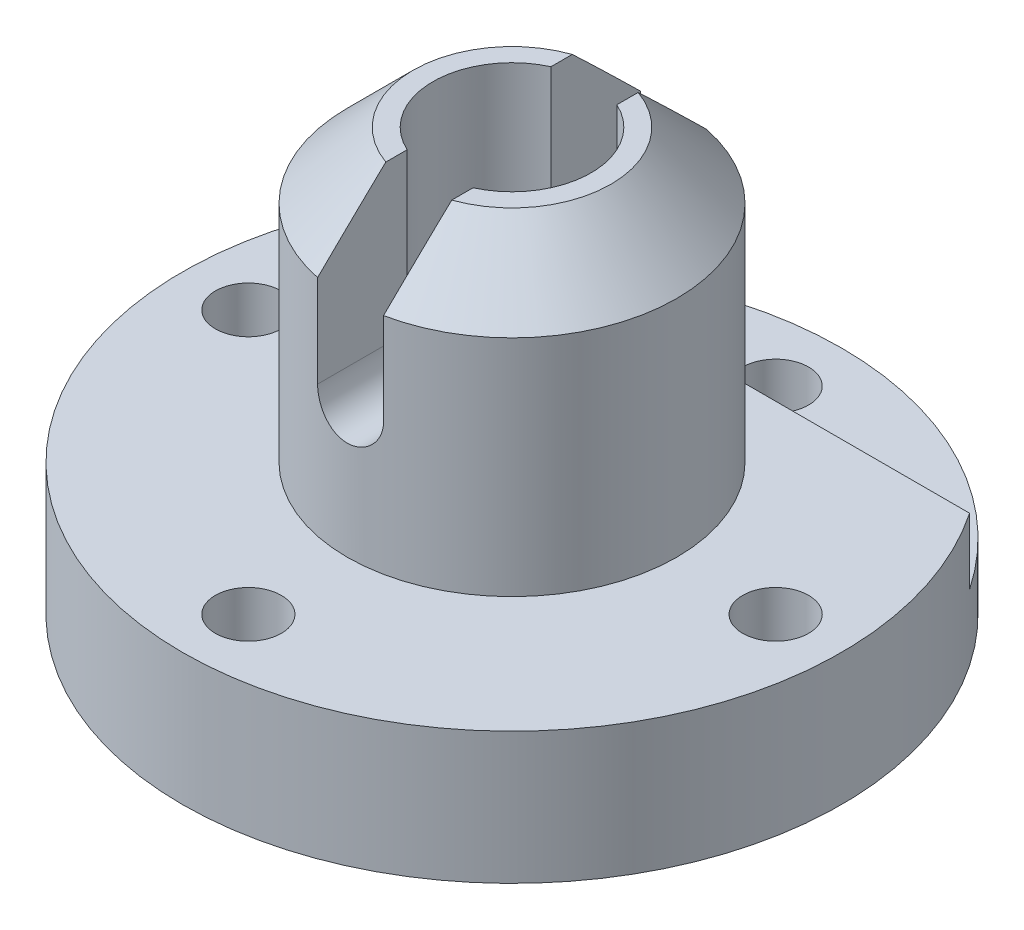
ISO-10303-21;
HEADER;
FILE_DESCRIPTION(('STEP AP214'),'2;1');
FILE_NAME('part.step','',(''),(''),'','','');
FILE_SCHEMA(('AUTOMOTIVE_DESIGN { 1 0 10303 214 1 1 1 1 }'));
ENDSEC;
DATA;
#1=APPLICATION_CONTEXT('core data for automotive mechanical design processes');
#2=APPLICATION_PROTOCOL_DEFINITION('international standard','automotive_design',2000,#1);
#3=PRODUCT_CONTEXT('',#1,'mechanical');
#4=PRODUCT('Part','Part','',(#3));
#5=PRODUCT_RELATED_PRODUCT_CATEGORY('part','',(#4));
#6=PRODUCT_DEFINITION_FORMATION('','',#4);
#7=PRODUCT_DEFINITION_CONTEXT('part definition',#1,'design');
#8=PRODUCT_DEFINITION('design','',#6,#7);
#9=PRODUCT_DEFINITION_SHAPE('','',#8);
#10=(LENGTH_UNIT() NAMED_UNIT(*) SI_UNIT(.MILLI.,.METRE.));
#11=(NAMED_UNIT(*) PLANE_ANGLE_UNIT() SI_UNIT($,.RADIAN.));
#12=(NAMED_UNIT(*) SI_UNIT($,.STERADIAN.) SOLID_ANGLE_UNIT());
#13=UNCERTAINTY_MEASURE_WITH_UNIT(LENGTH_MEASURE(1.E-05),#10,'distance_accuracy_value','');
#14=(GEOMETRIC_REPRESENTATION_CONTEXT(3) GLOBAL_UNCERTAINTY_ASSIGNED_CONTEXT((#13)) GLOBAL_UNIT_ASSIGNED_CONTEXT((#10,
#11,#12)) REPRESENTATION_CONTEXT('',''));
#15=CARTESIAN_POINT('',(0.,0.,0.));
#16=DIRECTION('',(0.,0.,1.));
#17=DIRECTION('',(1.,0.,0.));
#18=AXIS2_PLACEMENT_3D('',#15,#16,#17);
#19=CARTESIAN_POINT('',(0.,32.,0.));
#20=DIRECTION('',(0.,-1.,0.));
#21=DIRECTION('',(0.,0.,-1.));
#22=AXIS2_PLACEMENT_3D('',#19,#20,#21);
#23=CYLINDRICAL_SURFACE('',#22,6.);
#24=CARTESIAN_POINT('',(0.,10.,0.));
#25=DIRECTION('',(0.,1.,0.));
#26=DIRECTION('',(0.,0.,1.));
#27=AXIS2_PLACEMENT_3D('',#24,#25,#26);
#28=CIRCLE('',#27,6.);
#29=CARTESIAN_POINT('',(0.,10.,6.));
#30=VERTEX_POINT('',#29);
#31=EDGE_CURVE('E164',#30,#30,#28,.F.);
#32=ORIENTED_EDGE('',*,*,#31,.T.);
#33=EDGE_LOOP('',(#32));
#34=FACE_BOUND('',#33,.T.);
#35=CARTESIAN_POINT('',(0.,32.,0.));
#36=DIRECTION('',(0.,1.,0.));
#37=DIRECTION('',(0.,0.,1.));
#38=AXIS2_PLACEMENT_3D('',#35,#36,#37);
#39=CIRCLE('',#38,6.);
#40=CARTESIAN_POINT('',(-2.5,32.,-5.45435605731786));
#41=VERTEX_POINT('',#40);
#42=CARTESIAN_POINT('',(-2.5,32.,5.45435605731786));
#43=VERTEX_POINT('',#42);
#44=EDGE_CURVE('E154',#41,#43,#39,.T.);
#45=ORIENTED_EDGE('',*,*,#44,.T.);
#46=DIRECTION('',(0.,-1.,0.));
#47=VECTOR('',#46,1.);
#48=CARTESIAN_POINT('',(-2.5,32.,5.45435605731786));
#49=LINE('',#48,#47);
#50=CARTESIAN_POINT('',(-2.5,20.,5.45435605731786));
#51=VERTEX_POINT('',#50);
#52=EDGE_CURVE('E213',#43,#51,#49,.T.);
#53=ORIENTED_EDGE('',*,*,#52,.T.);
#54=CARTESIAN_POINT('',(2.5,20.,5.45435605731786));
#55=CARTESIAN_POINT('',(2.50001024965806,19.933009578603,5.4543414367274));
#56=CARTESIAN_POINT('',(2.49730766074456,19.8660271423929,5.45558986423115));
#57=CARTESIAN_POINT('',(2.48655699342007,19.732608782394,5.46050344433192));
#58=CARTESIAN_POINT('',(2.47851112553775,19.6661726441022,5.46416759753227));
#59=CARTESIAN_POINT('',(2.45719882557102,19.5345981401286,5.47378318611766));
#60=CARTESIAN_POINT('',(2.44395446621823,19.4694554951153,5.47972494833872));
#61=CARTESIAN_POINT('',(2.41239773056354,19.3406523494294,5.49369035165668));
#62=CARTESIAN_POINT('',(2.39408500729503,19.2769919505508,5.50171413528084));
#63=CARTESIAN_POINT('',(2.33184505253746,19.0890295233108,5.52852216859036));
#64=CARTESIAN_POINT('',(2.28056973965756,18.9674650590801,5.55006534458072));
#65=CARTESIAN_POINT('',(2.16009667726577,18.734605030022,5.5980502687434));
#66=CARTESIAN_POINT('',(2.09088024017803,18.6233203375838,5.62449711638194));
#67=CARTESIAN_POINT('',(1.93194216605246,18.4073444819703,5.68111739532849));
#68=CARTESIAN_POINT('',(1.84129131772597,18.3033685362414,5.71141645652258));
#69=CARTESIAN_POINT('',(1.64402473251641,18.1115830630309,5.77129106659512));
#70=CARTESIAN_POINT('',(1.53740558511416,18.0237769980765,5.80086645933832));
#71=CARTESIAN_POINT('',(1.30552662419109,17.8631011710238,5.85751079611205));
#72=CARTESIAN_POINT('',(1.17965801419142,17.7910465122975,5.88441492036276));
#73=CARTESIAN_POINT('',(0.916263349803656,17.6694476051954,5.93113050419022));
#74=CARTESIAN_POINT('',(0.778742558960749,17.6198932565872,5.95094514533806));
#75=CARTESIAN_POINT('',(0.503538212911764,17.5473214289529,5.98035028996095));
#76=CARTESIAN_POINT('',(0.366235636683351,17.5230570539867,5.99041924152298));
#77=CARTESIAN_POINT('',(0.0891608856613077,17.497724732109,6.00093656296527));
#78=CARTESIAN_POINT('',(-0.0506103107853693,17.4966477933812,6.00138866214753));
#79=CARTESIAN_POINT('',(-0.319586702683724,17.5170686483622,5.99290254661358));
#80=CARTESIAN_POINT('',(-0.448917245472143,17.5371965487351,5.98453414521297));
#81=CARTESIAN_POINT('',(-0.70216796354397,17.5971069089122,5.96013005449445));
#82=CARTESIAN_POINT('',(-0.826087834150438,17.6368904739846,5.94409393401056));
#83=CARTESIAN_POINT('',(-1.06727556823007,17.7354557836619,5.90559715444489));
#84=CARTESIAN_POINT('',(-1.1844130633202,17.7945181793044,5.88304219015531));
#85=CARTESIAN_POINT('',(-1.40742238732223,17.9296907819691,5.83371457161593));
#86=CARTESIAN_POINT('',(-1.51329009151026,18.0058071993045,5.80694038196897));
#87=CARTESIAN_POINT('',(-1.71867537807254,18.1791590335425,5.74963576527152));
#88=CARTESIAN_POINT('',(-1.81722082953265,18.2775041712583,5.71897359653013));
#89=CARTESIAN_POINT('',(-1.99685313522822,18.4894106464249,5.65876079183101));
#90=CARTESIAN_POINT('',(-2.07793113494236,18.6029796539946,5.62921072584973));
#91=CARTESIAN_POINT('',(-2.22284514508404,18.8468546501545,5.57361619012468));
#92=CARTESIAN_POINT('',(-2.2860150420634,18.9775928734739,5.54772171984214));
#93=CARTESIAN_POINT('',(-2.38897619183128,19.2491453734569,5.5041766144793));
#94=CARTESIAN_POINT('',(-2.4288105117282,19.3899405469978,5.48651080537515));
#95=CARTESIAN_POINT('',(-2.47065526537902,19.6101508434078,5.46773287951056));
#96=CARTESIAN_POINT('',(-2.48164099212926,19.6876310667866,5.46274303006064));
#97=CARTESIAN_POINT('',(-2.49631631258703,19.8433901813395,5.45604541462647));
#98=CARTESIAN_POINT('',(-2.50000851178051,19.9216687772607,5.45433647659977));
#99=CARTESIAN_POINT('',(-2.5,20.,5.45435605731786));
#100=B_SPLINE_CURVE_WITH_KNOTS('',3,(#54,#55,#56,#57,#58,#59,#60,#61,#62,#63,#64,#65,#66,#67,
#68,#69,#70,#71,#72,#73,#74,#75,#76,#77,#78,#79,#80,#81,#82,#83,#84,#85,#86,#87,#88,#89,#90,#91,
#92,#93,#94,#95,#96,#97,#98,#99),.UNSPECIFIED.,.F.,.F.,(4,2,2,2,2,2,2,2,2,2,2,2,2,2,2,2,2,2,2,2,
2,2,4),(0.,0.200891876435012,0.401700695097973,0.601665948391959,0.801644894158599,
1.20075599352942,1.6002844916061,2.02212344548655,2.44405262481498,2.88432120276328,
3.32439195134774,3.74155898035476,4.15856423395471,4.55019084443641,4.94183947919071,
5.33946474085078,5.73723503589979,6.16301556467703,6.58901142297275,7.02923147484727,
7.4686364954648,7.70350874445825,7.93829707423866),.UNSPECIFIED.);
#101=CARTESIAN_POINT('',(2.5,20.,5.45435605731786));
#102=VERTEX_POINT('',#101);
#103=EDGE_CURVE('E146',#102,#51,#100,.T.);
#104=ORIENTED_EDGE('',*,*,#103,.F.);
#105=DIRECTION('',(0.,-1.,0.));
#106=VECTOR('',#105,1.);
#107=CARTESIAN_POINT('',(2.5,32.,5.45435605731786));
#108=LINE('',#107,#106);
#109=CARTESIAN_POINT('',(2.5,32.,5.45435605731786));
#110=VERTEX_POINT('',#109);
#111=EDGE_CURVE('E132',#110,#102,#108,.T.);
#112=ORIENTED_EDGE('',*,*,#111,.F.);
#113=CARTESIAN_POINT('',(2.5,32.,-5.45435605731786));
#114=VERTEX_POINT('',#113);
#115=EDGE_CURVE('E144',#110,#114,#39,.T.);
#116=ORIENTED_EDGE('',*,*,#115,.T.);
#117=DIRECTION('',(0.,-1.,0.));
#118=VECTOR('',#117,1.);
#119=CARTESIAN_POINT('',(2.5,32.,-5.45435605731786));
#120=LINE('',#119,#118);
#121=CARTESIAN_POINT('',(2.5,20.,-5.45435605731786));
#122=VERTEX_POINT('',#121);
#123=EDGE_CURVE('E148',#122,#114,#120,.F.);
#124=ORIENTED_EDGE('',*,*,#123,.F.);
#125=CARTESIAN_POINT('',(-2.5,20.,-5.45435605731786));
#126=CARTESIAN_POINT('',(-2.50001024965806,19.933009578603,-5.4543414367274));
#127=CARTESIAN_POINT('',(-2.49730766074456,19.8660271423929,-5.45558986423115));
#128=CARTESIAN_POINT('',(-2.48655699342007,19.732608782394,-5.46050344433192));
#129=CARTESIAN_POINT('',(-2.47851112553775,19.6661726441022,-5.46416759753227));
#130=CARTESIAN_POINT('',(-2.45719882557102,19.5345981401286,-5.47378318611766));
#131=CARTESIAN_POINT('',(-2.44395446621823,19.4694554951153,-5.47972494833872));
#132=CARTESIAN_POINT('',(-2.41239773056354,19.3406523494294,-5.49369035165668));
#133=CARTESIAN_POINT('',(-2.39408500729503,19.2769919505508,-5.50171413528084));
#134=CARTESIAN_POINT('',(-2.33184505253746,19.0890295233108,-5.52852216859036));
#135=CARTESIAN_POINT('',(-2.28056973965756,18.9674650590801,-5.55006534458073));
#136=CARTESIAN_POINT('',(-2.16009667726576,18.734605030022,-5.5980502687434));
#137=CARTESIAN_POINT('',(-2.09088024017802,18.6233203375838,-5.62449711638194));
#138=CARTESIAN_POINT('',(-1.93194216605246,18.4073444819703,-5.6811173953285));
#139=CARTESIAN_POINT('',(-1.84129131772596,18.3033685362415,-5.71141645652258));
#140=CARTESIAN_POINT('',(-1.6440247325164,18.1115830630309,-5.77129106659512));
#141=CARTESIAN_POINT('',(-1.53740558511415,18.0237769980765,-5.80086645933832));
#142=CARTESIAN_POINT('',(-1.30552662419109,17.8631011710238,-5.85751079611205));
#143=CARTESIAN_POINT('',(-1.17965801419141,17.7910465122975,-5.88441492036276));
#144=CARTESIAN_POINT('',(-0.916263349803652,17.6694476051954,-5.93113050419023));
#145=CARTESIAN_POINT('',(-0.778742558960745,17.6198932565872,-5.95094514533806));
#146=CARTESIAN_POINT('',(-0.50353821291176,17.5473214289529,-5.98035028996095));
#147=CARTESIAN_POINT('',(-0.366235636683347,17.5230570539867,-5.99041924152298));
#148=CARTESIAN_POINT('',(-0.0891608856613034,17.497724732109,-6.00093656296527));
#149=CARTESIAN_POINT('',(0.0506103107853736,17.4966477933812,-6.00138866214753));
#150=CARTESIAN_POINT('',(0.319586702683728,17.5170686483622,-5.99290254661358));
#151=CARTESIAN_POINT('',(0.448917245472147,17.5371965487351,-5.98453414521297));
#152=CARTESIAN_POINT('',(0.702167963543975,17.5971069089122,-5.96013005449445));
#153=CARTESIAN_POINT('',(0.826087834150443,17.6368904739846,-5.94409393401056));
#154=CARTESIAN_POINT('',(1.06727556823007,17.7354557836619,-5.90559715444489));
#155=CARTESIAN_POINT('',(1.18441306332021,17.7945181793044,-5.88304219015531));
#156=CARTESIAN_POINT('',(1.40742238732224,17.9296907819691,-5.83371457161593));
#157=CARTESIAN_POINT('',(1.51329009151026,18.0058071993045,-5.80694038196897));
#158=CARTESIAN_POINT('',(1.71867537807254,18.1791590335425,-5.74963576527152));
#159=CARTESIAN_POINT('',(1.81722082953265,18.2775041712583,-5.71897359653013));
#160=CARTESIAN_POINT('',(1.99685313522822,18.4894106464249,-5.65876079183101));
#161=CARTESIAN_POINT('',(2.07793113494236,18.6029796539946,-5.62921072584973));
#162=CARTESIAN_POINT('',(2.22284514508405,18.8468546501545,-5.57361619012468));
#163=CARTESIAN_POINT('',(2.28601504206341,18.9775928734739,-5.54772171984214));
#164=CARTESIAN_POINT('',(2.38897619183128,19.2491453734569,-5.50417661447929));
#165=CARTESIAN_POINT('',(2.4288105117282,19.3899405469978,-5.48651080537515));
#166=CARTESIAN_POINT('',(2.47065526537903,19.6101508434078,-5.46773287951056));
#167=CARTESIAN_POINT('',(2.48164099212927,19.6876310667866,-5.46274303006064));
#168=CARTESIAN_POINT('',(2.49631631258704,19.8433901813395,-5.45604541462647));
#169=CARTESIAN_POINT('',(2.50000851178052,19.9216687772607,-5.45433647659977));
#170=CARTESIAN_POINT('',(2.5,20.,-5.45435605731786));
#171=B_SPLINE_CURVE_WITH_KNOTS('',3,(#125,#126,#127,#128,#129,#130,#131,#132,#133,#134,#135,
#136,#137,#138,#139,#140,#141,#142,#143,#144,#145,#146,#147,#148,#149,#150,#151,#152,#153,#154,
#155,#156,#157,#158,#159,#160,#161,#162,#163,#164,#165,#166,#167,#168,#169,#170),.UNSPECIFIED.,
.F.,.F.,(4,2,2,2,2,2,2,2,2,2,2,2,2,2,2,2,2,2,2,2,2,2,4),(0.,0.200891876435012,0.401700695097973,
0.601665948391959,0.801644894158599,1.20075599352942,1.6002844916061,2.02212344548655,
2.44405262481498,2.88432120276328,3.32439195134774,3.74155898035476,4.15856423395471,
4.55019084443641,4.94183947919071,5.33946474085078,5.73723503589979,6.16301556467703,
6.58901142297275,7.02923147484728,7.4686364954648,7.70350874445825,7.93829707423866),.UNSPECIFIED.);
#172=CARTESIAN_POINT('',(-2.5,20.,-5.45435605731786));
#173=VERTEX_POINT('',#172);
#174=EDGE_CURVE('E208',#173,#122,#171,.T.);
#175=ORIENTED_EDGE('',*,*,#174,.F.);
#176=DIRECTION('',(0.,-1.,0.));
#177=VECTOR('',#176,1.);
#178=CARTESIAN_POINT('',(-2.5,32.,-5.45435605731786));
#179=LINE('',#178,#177);
#180=EDGE_CURVE('E323',#173,#41,#179,.F.);
#181=ORIENTED_EDGE('',*,*,#180,.T.);
#182=EDGE_LOOP('',(#45,#53,#104,#112,#116,#124,#175,#181));
#183=FACE_BOUND('',#182,.T.);
#184=ADVANCED_FACE('F38',(#34,#183),#23,.F.);
#185=CARTESIAN_POINT('',(0.,32.,0.));
#186=DIRECTION('',(0.,-1.,0.));
#187=DIRECTION('',(0.,0.,-1.));
#188=AXIS2_PLACEMENT_3D('',#185,#186,#187);
#189=CYLINDRICAL_SURFACE('',#188,12.5);
#190=CARTESIAN_POINT('',(0.,10.,0.));
#191=DIRECTION('',(0.,1.,0.));
#192=DIRECTION('',(0.,0.,1.));
#193=AXIS2_PLACEMENT_3D('',#190,#191,#192);
#194=CIRCLE('',#193,12.5);
#195=CARTESIAN_POINT('',(0.,10.,12.5));
#196=VERTEX_POINT('',#195);
#197=EDGE_CURVE('E153',#196,#196,#194,.F.);
#198=ORIENTED_EDGE('',*,*,#197,.F.);
#199=EDGE_LOOP('',(#198));
#200=FACE_BOUND('',#199,.T.);
#201=DIRECTION('',(0.,-1.,0.));
#202=VECTOR('',#201,1.);
#203=CARTESIAN_POINT('',(-2.5,32.,12.2474487139159));
#204=LINE('',#203,#202);
#205=CARTESIAN_POINT('',(-2.5,27.,12.2474487139159));
#206=VERTEX_POINT('',#205);
#207=CARTESIAN_POINT('',(-2.5,20.,12.2474487139159));
#208=VERTEX_POINT('',#207);
#209=EDGE_CURVE('E322',#206,#208,#204,.T.);
#210=ORIENTED_EDGE('',*,*,#209,.F.);
#211=CARTESIAN_POINT('',(0.,27.,0.));
#212=DIRECTION('',(0.,1.,0.));
#213=DIRECTION('',(0.,0.,1.));
#214=AXIS2_PLACEMENT_3D('',#211,#212,#213);
#215=CIRCLE('',#214,12.5);
#216=CARTESIAN_POINT('',(-2.5,27.,-12.2474487139159));
#217=VERTEX_POINT('',#216);
#218=EDGE_CURVE('E258',#206,#217,#215,.F.);
#219=ORIENTED_EDGE('',*,*,#218,.T.);
#220=DIRECTION('',(0.,-1.,0.));
#221=VECTOR('',#220,1.);
#222=CARTESIAN_POINT('',(-2.5,32.,-12.2474487139159));
#223=LINE('',#222,#221);
#224=CARTESIAN_POINT('',(-2.5,20.,-12.2474487139159));
#225=VERTEX_POINT('',#224);
#226=EDGE_CURVE('E147',#225,#217,#223,.F.);
#227=ORIENTED_EDGE('',*,*,#226,.F.);
#228=CARTESIAN_POINT('',(-2.5,20.,-12.2474487139159));
#229=CARTESIAN_POINT('',(-2.50000755272741,19.9304359928512,-12.2474426870481));
#230=CARTESIAN_POINT('',(-2.49709659553059,19.8608761581153,-12.2480412546813));
#231=CARTESIAN_POINT('',(-2.48549624534853,19.7222682500258,-12.2504029528616));
#232=CARTESIAN_POINT('',(-2.47680756718742,19.6532201144329,-12.2521659393457));
#233=CARTESIAN_POINT('',(-2.45372788482214,19.5162257533478,-12.25680833904));
#234=CARTESIAN_POINT('',(-2.43934556755122,19.4482780125864,-12.259686051341));
#235=CARTESIAN_POINT('',(-2.40500601307056,19.3138779894138,-12.2664685140533));
#236=CARTESIAN_POINT('',(-2.38504875310239,19.2474257131086,-12.2703732686573));
#237=CARTESIAN_POINT('',(-2.31701273293409,19.0509952453208,-12.2834692504436));
#238=CARTESIAN_POINT('',(-2.26075131705718,18.9238349517029,-12.2940461363477));
#239=CARTESIAN_POINT('',(-2.12812970933265,18.6808105143781,-12.3176934066007));
#240=CARTESIAN_POINT('',(-2.0517674343692,18.5649475431551,-12.3307640493469));
#241=CARTESIAN_POINT('',(-1.87995278838546,18.3461078517031,-12.3581317705241));
#242=CARTESIAN_POINT('',(-1.78427266064757,18.2433112895975,-12.3724421926957));
#243=CARTESIAN_POINT('',(-1.57702607132326,18.0551119063013,-12.4005606698654));
#244=CARTESIAN_POINT('',(-1.46545715284151,17.9697117801072,-12.4143686467546));
#245=CARTESIAN_POINT('',(-1.2284002437141,17.8180282891781,-12.4400702526805));
#246=CARTESIAN_POINT('',(-1.10279959145392,17.751917721986,-12.4519461799055));
#247=CARTESIAN_POINT('',(-0.842002975760172,17.6418101436303,-12.4722938885068));
#248=CARTESIAN_POINT('',(-0.706808435013477,17.5978098614993,-12.4807661733763));
#249=CARTESIAN_POINT('',(-0.432543529973129,17.5337324169305,-12.4932579438613));
#250=CARTESIAN_POINT('',(-0.293547588516976,17.5133480364947,-12.4973345628875));
#251=CARTESIAN_POINT('',(-0.0140496897959922,17.4961225412003,-12.5007730438039));
#252=CARTESIAN_POINT('',(0.126452156532597,17.499279703838,-12.5001352506414));
#253=CARTESIAN_POINT('',(0.402855506346822,17.5288155036062,-12.494260861056));
#254=CARTESIAN_POINT('',(0.538794033247035,17.5548626254794,-12.4890899207821));
#255=CARTESIAN_POINT('',(0.804330016531258,17.6289129417226,-12.4748043625546));
#256=CARTESIAN_POINT('',(0.933927265392435,17.6769168541128,-12.4656896156329));
#257=CARTESIAN_POINT('',(1.1840506782429,17.7938260089324,-12.4444322280103));
#258=CARTESIAN_POINT('',(1.30451431703059,17.8628614673669,-12.4322708097766));
#259=CARTESIAN_POINT('',(1.53226609471824,18.0197756756397,-12.4062612907301));
#260=CARTESIAN_POINT('',(1.63955314055332,18.1076559870953,-12.3924130501763));
#261=CARTESIAN_POINT('',(1.83986551634353,18.3015709040774,-12.3642759342124));
#262=CARTESIAN_POINT('',(1.93261173748933,18.4078935051827,-12.3499835810434));
#263=CARTESIAN_POINT('',(2.0990272497494,18.6347618962184,-12.3227926529107));
#264=CARTESIAN_POINT('',(2.17269125605404,18.7553116129146,-12.3098944646352));
#265=CARTESIAN_POINT('',(2.29894988661171,19.0076310123658,-12.286943251058));
#266=CARTESIAN_POINT('',(2.3514871915862,19.1394300584917,-12.2768979874586));
#267=CARTESIAN_POINT('',(2.43351774332483,19.4101465781389,-12.2609040265623));
#268=CARTESIAN_POINT('',(2.46304531871083,19.5490531166203,-12.2549492282072));
#269=CARTESIAN_POINT('',(2.48708234530492,19.7408920421161,-12.2500794297991));
#270=CARTESIAN_POINT('',(2.49192813913878,19.7926353494561,-12.2490939967998));
#271=CARTESIAN_POINT('',(2.49838291166163,19.8962446603435,-12.2477791846693));
#272=CARTESIAN_POINT('',(2.49999730726164,19.9481103123894,-12.2474487076206));
#273=CARTESIAN_POINT('',(2.5,20.,-12.2474487139159));
#274=B_SPLINE_CURVE_WITH_KNOTS('',3,(#228,#229,#230,#231,#232,#233,#234,#235,#236,#237,#238,
#239,#240,#241,#242,#243,#244,#245,#246,#247,#248,#249,#250,#251,#252,#253,#254,#255,#256,#257,
#258,#259,#260,#261,#262,#263,#264,#265,#266,#267,#268,#269,#270,#271,#272,#273),.UNSPECIFIED.,
.F.,.F.,(4,2,2,2,2,2,2,2,2,2,2,2,2,2,2,2,2,2,2,2,2,2,4),(0.,0.208621275894803,0.417216745803839,
0.62549517523698,0.833774454931106,1.25000691135225,1.66628252025787,2.08778731527755,
2.50935735880446,2.93459542557449,3.35977056463055,3.77935021287091,4.19889916132035,
4.61247011057754,5.02605458519858,5.44225366753897,5.85848725240716,6.28192795775072,
6.70548580970531,7.13018519486866,7.55424974394838,7.71010621722895,7.86570120305829),.UNSPECIFIED.);
#275=CARTESIAN_POINT('',(2.5,20.,-12.2474487139159));
#276=VERTEX_POINT('',#275);
#277=EDGE_CURVE('E175',#225,#276,#274,.T.);
#278=ORIENTED_EDGE('',*,*,#277,.T.);
#279=DIRECTION('',(0.,-1.,0.));
#280=VECTOR('',#279,1.);
#281=CARTESIAN_POINT('',(2.5,32.,-12.2474487139159));
#282=LINE('',#281,#280);
#283=CARTESIAN_POINT('',(2.5,27.,-12.2474487139159));
#284=VERTEX_POINT('',#283);
#285=EDGE_CURVE('E314',#276,#284,#282,.F.);
#286=ORIENTED_EDGE('',*,*,#285,.T.);
#287=CARTESIAN_POINT('',(0.,27.,0.));
#288=DIRECTION('',(0.,1.,0.));
#289=DIRECTION('',(0.,0.,1.));
#290=AXIS2_PLACEMENT_3D('',#287,#288,#289);
#291=CIRCLE('',#290,12.5);
#292=CARTESIAN_POINT('',(2.5,27.,12.2474487139159));
#293=VERTEX_POINT('',#292);
#294=EDGE_CURVE('E339',#284,#293,#291,.F.);
#295=ORIENTED_EDGE('',*,*,#294,.T.);
#296=DIRECTION('',(0.,-1.,0.));
#297=VECTOR('',#296,1.);
#298=CARTESIAN_POINT('',(2.5,32.,12.2474487139159));
#299=LINE('',#298,#297);
#300=CARTESIAN_POINT('',(2.5,20.,12.2474487139159));
#301=VERTEX_POINT('',#300);
#302=EDGE_CURVE('E317',#293,#301,#299,.T.);
#303=ORIENTED_EDGE('',*,*,#302,.T.);
#304=CARTESIAN_POINT('',(2.5,20.,12.2474487139159));
#305=CARTESIAN_POINT('',(2.50000755272741,19.9304359928512,12.2474426870481));
#306=CARTESIAN_POINT('',(2.4970965955306,19.8608761581153,12.2480412546813));
#307=CARTESIAN_POINT('',(2.48549624534853,19.7222682500258,12.2504029528616));
#308=CARTESIAN_POINT('',(2.47680756718743,19.6532201144329,12.2521659393457));
#309=CARTESIAN_POINT('',(2.45372788482215,19.5162257533478,12.25680833904));
#310=CARTESIAN_POINT('',(2.43934556755123,19.4482780125864,12.259686051341));
#311=CARTESIAN_POINT('',(2.40500601307056,19.3138779894138,12.2664685140532));
#312=CARTESIAN_POINT('',(2.38504875310239,19.2474257131086,12.2703732686573));
#313=CARTESIAN_POINT('',(2.31701273293409,19.0509952453208,12.2834692504436));
#314=CARTESIAN_POINT('',(2.26075131705718,18.9238349517029,12.2940461363477));
#315=CARTESIAN_POINT('',(2.12812970933265,18.6808105143781,12.3176934066007));
#316=CARTESIAN_POINT('',(2.0517674343692,18.5649475431551,12.3307640493469));
#317=CARTESIAN_POINT('',(1.87995278838546,18.3461078517031,12.3581317705241));
#318=CARTESIAN_POINT('',(1.78427266064758,18.2433112895975,12.3724421926957));
#319=CARTESIAN_POINT('',(1.57702607132326,18.0551119063013,12.4005606698654));
#320=CARTESIAN_POINT('',(1.46545715284151,17.9697117801072,12.4143686467546));
#321=CARTESIAN_POINT('',(1.2284002437141,17.8180282891781,12.4400702526805));
#322=CARTESIAN_POINT('',(1.10279959145392,17.751917721986,12.4519461799055));
#323=CARTESIAN_POINT('',(0.842002975760175,17.6418101436303,12.4722938885068));
#324=CARTESIAN_POINT('',(0.70680843501348,17.5978098614993,12.4807661733763));
#325=CARTESIAN_POINT('',(0.432543529973132,17.5337324169305,12.4932579438613));
#326=CARTESIAN_POINT('',(0.293547588516979,17.5133480364947,12.4973345628875));
#327=CARTESIAN_POINT('',(0.0140496897959956,17.4961225412003,12.5007730438039));
#328=CARTESIAN_POINT('',(-0.126452156532594,17.499279703838,12.5001352506414));
#329=CARTESIAN_POINT('',(-0.402855506346818,17.5288155036062,12.494260861056));
#330=CARTESIAN_POINT('',(-0.538794033247031,17.5548626254794,12.4890899207821));
#331=CARTESIAN_POINT('',(-0.804330016531254,17.6289129417226,12.4748043625546));
#332=CARTESIAN_POINT('',(-0.933927265392431,17.6769168541128,12.4656896156329));
#333=CARTESIAN_POINT('',(-1.1840506782429,17.7938260089324,12.4444322280103));
#334=CARTESIAN_POINT('',(-1.30451431703059,17.8628614673669,12.4322708097766));
#335=CARTESIAN_POINT('',(-1.53226609471824,18.0197756756397,12.4062612907301));
#336=CARTESIAN_POINT('',(-1.63955314055331,18.1076559870953,12.3924130501763));
#337=CARTESIAN_POINT('',(-1.83986551634353,18.3015709040774,12.3642759342124));
#338=CARTESIAN_POINT('',(-1.93261173748932,18.4078935051827,12.3499835810434));
#339=CARTESIAN_POINT('',(-2.0990272497494,18.6347618962184,12.3227926529107));
#340=CARTESIAN_POINT('',(-2.17269125605403,18.7553116129146,12.3098944646352));
#341=CARTESIAN_POINT('',(-2.29894988661171,19.0076310123658,12.286943251058));
#342=CARTESIAN_POINT('',(-2.35148719158619,19.1394300584917,12.2768979874586));
#343=CARTESIAN_POINT('',(-2.43351774332483,19.4101465781389,12.2609040265623));
#344=CARTESIAN_POINT('',(-2.46304531871083,19.5490531166203,12.2549492282072));
#345=CARTESIAN_POINT('',(-2.48708234530491,19.7408920421161,12.2500794297991));
#346=CARTESIAN_POINT('',(-2.49192813913877,19.7926353494561,12.2490939967998));
#347=CARTESIAN_POINT('',(-2.49838291166163,19.8962446603435,12.2477791846693));
#348=CARTESIAN_POINT('',(-2.49999730726164,19.9481103123894,12.2474487076206));
#349=CARTESIAN_POINT('',(-2.5,20.,12.2474487139159));
#350=B_SPLINE_CURVE_WITH_KNOTS('',3,(#304,#305,#306,#307,#308,#309,#310,#311,#312,#313,#314,
#315,#316,#317,#318,#319,#320,#321,#322,#323,#324,#325,#326,#327,#328,#329,#330,#331,#332,#333,
#334,#335,#336,#337,#338,#339,#340,#341,#342,#343,#344,#345,#346,#347,#348,#349),.UNSPECIFIED.,
.F.,.F.,(4,2,2,2,2,2,2,2,2,2,2,2,2,2,2,2,2,2,2,2,2,2,4),(0.,0.208621275894803,0.417216745803839,
0.62549517523698,0.833774454931106,1.25000691135225,1.66628252025787,2.08778731527756,
2.50935735880446,2.93459542557449,3.35977056463055,3.77935021287091,4.19889916132035,
4.61247011057754,5.02605458519858,5.44225366753897,5.85848725240716,6.28192795775072,
6.70548580970531,7.13018519486866,7.55424974394838,7.71010621722896,7.86570120305829),.UNSPECIFIED.);
#351=EDGE_CURVE('E183',#301,#208,#350,.T.);
#352=ORIENTED_EDGE('',*,*,#351,.T.);
#353=EDGE_LOOP('',(#210,#219,#227,#278,#286,#295,#303,#352));
#354=FACE_BOUND('',#353,.T.);
#355=ADVANCED_FACE('F188',(#200,#354),#189,.T.);
#356=CARTESIAN_POINT('',(0.,32.,0.));
#357=DIRECTION('',(0.,1.,0.));
#358=DIRECTION('',(0.,0.,1.));
#359=AXIS2_PLACEMENT_3D('',#356,#357,#358);
#360=PLANE('',#359);
#361=DIRECTION('',(0.,0.,-1.));
#362=VECTOR('',#361,1.);
#363=CARTESIAN_POINT('',(-2.5,32.,0.));
#364=LINE('',#363,#362);
#365=CARTESIAN_POINT('',(-2.5,32.,-7.07106781186548));
#366=VERTEX_POINT('',#365);
#367=EDGE_CURVE('E136',#41,#366,#364,.T.);
#368=ORIENTED_EDGE('',*,*,#367,.T.);
#369=CARTESIAN_POINT('',(0.,32.,0.));
#370=DIRECTION('',(0.,1.,0.));
#371=DIRECTION('',(0.,0.,1.));
#372=AXIS2_PLACEMENT_3D('',#369,#370,#371);
#373=CIRCLE('',#372,7.50000000000001);
#374=CARTESIAN_POINT('',(-2.5,32.,7.07106781186548));
#375=VERTEX_POINT('',#374);
#376=EDGE_CURVE('E335',#366,#375,#373,.T.);
#377=ORIENTED_EDGE('',*,*,#376,.T.);
#378=EDGE_CURVE('E174',#375,#43,#364,.T.);
#379=ORIENTED_EDGE('',*,*,#378,.T.);
#380=ORIENTED_EDGE('',*,*,#44,.F.);
#381=EDGE_LOOP('',(#368,#377,#379,#380));
#382=FACE_BOUND('',#381,.T.);
#383=ADVANCED_FACE('F235',(#382),#360,.T.);
#384=CARTESIAN_POINT('',(0.,10.,0.));
#385=DIRECTION('',(0.,-1.,0.));
#386=DIRECTION('',(0.,0.,-1.));
#387=AXIS2_PLACEMENT_3D('',#384,#385,#386);
#388=CYLINDRICAL_SURFACE('',#387,25.);
#389=CARTESIAN_POINT('',(0.,0.,0.));
#390=DIRECTION('',(0.,1.,0.));
#391=DIRECTION('',(0.,0.,1.));
#392=AXIS2_PLACEMENT_3D('',#389,#390,#391);
#393=CIRCLE('',#392,25.);
#394=CARTESIAN_POINT('',(0.,0.,25.));
#395=VERTEX_POINT('',#394);
#396=EDGE_CURVE('E157',#395,#395,#393,.T.);
#397=ORIENTED_EDGE('',*,*,#396,.T.);
#398=EDGE_LOOP('',(#397));
#399=FACE_BOUND('',#398,.T.);
#400=DIRECTION('',(0.,-1.,0.));
#401=VECTOR('',#400,1.);
#402=CARTESIAN_POINT('',(20.712315177208,52.8602379834737,-14.));
#403=LINE('',#402,#401);
#404=CARTESIAN_POINT('',(20.712315177208,10.,-14.));
#405=VERTEX_POINT('',#404);
#406=CARTESIAN_POINT('',(20.712315177208,5.,-14.));
#407=VERTEX_POINT('',#406);
#408=EDGE_CURVE('E353',#405,#407,#403,.T.);
#409=ORIENTED_EDGE('',*,*,#408,.F.);
#410=CARTESIAN_POINT('',(0.,10.,0.));
#411=DIRECTION('',(0.,1.,0.));
#412=DIRECTION('',(0.,0.,1.));
#413=AXIS2_PLACEMENT_3D('',#410,#411,#412);
#414=CIRCLE('',#413,25.);
#415=CARTESIAN_POINT('',(-20.712315177208,10.,-14.));
#416=VERTEX_POINT('',#415);
#417=EDGE_CURVE('E167',#416,#405,#414,.T.);
#418=ORIENTED_EDGE('',*,*,#417,.F.);
#419=DIRECTION('',(0.,-1.,0.));
#420=VECTOR('',#419,1.);
#421=CARTESIAN_POINT('',(-20.712315177208,52.8602379834737,-14.));
#422=LINE('',#421,#420);
#423=CARTESIAN_POINT('',(-20.712315177208,5.,-14.));
#424=VERTEX_POINT('',#423);
#425=EDGE_CURVE('E161',#416,#424,#422,.T.);
#426=ORIENTED_EDGE('',*,*,#425,.T.);
#427=CARTESIAN_POINT('',(0.,5.,0.));
#428=DIRECTION('',(0.,1.,0.));
#429=DIRECTION('',(0.,0.,1.));
#430=AXIS2_PLACEMENT_3D('',#427,#428,#429);
#431=CIRCLE('',#430,25.);
#432=EDGE_CURVE('E355',#407,#424,#431,.T.);
#433=ORIENTED_EDGE('',*,*,#432,.F.);
#434=EDGE_LOOP('',(#409,#418,#426,#433));
#435=FACE_BOUND('',#434,.T.);
#436=ADVANCED_FACE('F228',(#399,#435),#388,.T.);
#437=CARTESIAN_POINT('',(0.,10.,0.));
#438=DIRECTION('',(0.,1.,0.));
#439=DIRECTION('',(0.,0.,1.));
#440=AXIS2_PLACEMENT_3D('',#437,#438,#439);
#441=PLANE('',#440);
#442=CARTESIAN_POINT('',(-20.,10.,0.));
#443=DIRECTION('',(0.,1.,0.));
#444=DIRECTION('',(0.,0.,1.));
#445=AXIS2_PLACEMENT_3D('',#442,#443,#444);
#446=CIRCLE('',#445,2.5);
#447=CARTESIAN_POINT('',(-20.,10.,2.50000000000007));
#448=VERTEX_POINT('',#447);
#449=EDGE_CURVE('E284',#448,#448,#446,.F.);
#450=ORIENTED_EDGE('',*,*,#449,.T.);
#451=EDGE_LOOP('',(#450));
#452=FACE_BOUND('',#451,.T.);
#453=CARTESIAN_POINT('',(0.,10.,20.));
#454=DIRECTION('',(0.,1.,0.));
#455=DIRECTION('',(0.,0.,1.));
#456=AXIS2_PLACEMENT_3D('',#453,#454,#455);
#457=CIRCLE('',#456,2.5);
#458=CARTESIAN_POINT('',(0.,10.,22.5));
#459=VERTEX_POINT('',#458);
#460=EDGE_CURVE('E292',#459,#459,#457,.F.);
#461=ORIENTED_EDGE('',*,*,#460,.T.);
#462=EDGE_LOOP('',(#461));
#463=FACE_BOUND('',#462,.T.);
#464=CARTESIAN_POINT('',(20.,10.,-2.09488880330588E-13));
#465=DIRECTION('',(0.,1.,0.));
#466=DIRECTION('',(0.,0.,1.));
#467=AXIS2_PLACEMENT_3D('',#464,#465,#466);
#468=CIRCLE('',#467,2.5);
#469=CARTESIAN_POINT('',(20.,10.,2.49999999999979));
#470=VERTEX_POINT('',#469);
#471=EDGE_CURVE('E288',#470,#470,#468,.F.);
#472=ORIENTED_EDGE('',*,*,#471,.T.);
#473=EDGE_LOOP('',(#472));
#474=FACE_BOUND('',#473,.T.);
#475=ORIENTED_EDGE('',*,*,#197,.T.);
#476=EDGE_LOOP('',(#475));
#477=FACE_BOUND('',#476,.T.);
#478=ORIENTED_EDGE('',*,*,#417,.T.);
#479=DIRECTION('',(1.,0.,0.));
#480=VECTOR('',#479,1.);
#481=CARTESIAN_POINT('',(0.,10.,-14.));
#482=LINE('',#481,#480);
#483=EDGE_CURVE('E159',#416,#405,#482,.T.);
#484=ORIENTED_EDGE('',*,*,#483,.F.);
#485=EDGE_LOOP('',(#478,#484));
#486=FACE_BOUND('',#485,.T.);
#487=ADVANCED_FACE('F223',(#452,#463,#474,#477,#486),#441,.T.);
#488=CARTESIAN_POINT('',(0.,0.,0.));
#489=DIRECTION('',(0.,1.,0.));
#490=DIRECTION('',(0.,0.,1.));
#491=AXIS2_PLACEMENT_3D('',#488,#489,#490);
#492=PLANE('',#491);
#493=CARTESIAN_POINT('',(-20.,0.,0.));
#494=DIRECTION('',(0.,1.,0.));
#495=DIRECTION('',(1.,0.,0.));
#496=AXIS2_PLACEMENT_3D('',#493,#494,#495);
#497=CIRCLE('',#496,2.5);
#498=CARTESIAN_POINT('',(-17.5,0.,0.));
#499=VERTEX_POINT('',#498);
#500=EDGE_CURVE('E287',#499,#499,#497,.T.);
#501=ORIENTED_EDGE('',*,*,#500,.T.);
#502=EDGE_LOOP('',(#501));
#503=FACE_BOUND('',#502,.T.);
#504=CARTESIAN_POINT('',(0.,0.,20.));
#505=DIRECTION('',(0.,1.,0.));
#506=DIRECTION('',(0.,0.,-1.));
#507=AXIS2_PLACEMENT_3D('',#504,#505,#506);
#508=CIRCLE('',#507,2.5);
#509=CARTESIAN_POINT('',(0.,0.,17.5));
#510=VERTEX_POINT('',#509);
#511=EDGE_CURVE('E289',#510,#510,#508,.T.);
#512=ORIENTED_EDGE('',*,*,#511,.T.);
#513=EDGE_LOOP('',(#512));
#514=FACE_BOUND('',#513,.T.);
#515=CARTESIAN_POINT('',(20.,0.,-2.09488880330588E-13));
#516=DIRECTION('',(0.,1.,0.));
#517=DIRECTION('',(-1.,0.,0.));
#518=AXIS2_PLACEMENT_3D('',#515,#516,#517);
#519=CIRCLE('',#518,2.5);
#520=CARTESIAN_POINT('',(17.5,0.,-1.83302770289264E-13));
#521=VERTEX_POINT('',#520);
#522=EDGE_CURVE('E295',#521,#521,#519,.T.);
#523=ORIENTED_EDGE('',*,*,#522,.T.);
#524=EDGE_LOOP('',(#523));
#525=FACE_BOUND('',#524,.T.);
#526=CARTESIAN_POINT('',(0.,0.,-20.));
#527=DIRECTION('',(0.,1.,0.));
#528=DIRECTION('',(0.,0.,1.));
#529=AXIS2_PLACEMENT_3D('',#526,#527,#528);
#530=CIRCLE('',#529,2.5);
#531=CARTESIAN_POINT('',(0.,0.,-17.5));
#532=VERTEX_POINT('',#531);
#533=EDGE_CURVE('E303',#532,#532,#530,.T.);
#534=ORIENTED_EDGE('',*,*,#533,.T.);
#535=EDGE_LOOP('',(#534));
#536=FACE_BOUND('',#535,.T.);
#537=ORIENTED_EDGE('',*,*,#396,.F.);
#538=EDGE_LOOP('',(#537));
#539=FACE_BOUND('',#538,.T.);
#540=ADVANCED_FACE('F227',(#503,#514,#525,#536,#539),#492,.F.);
#541=DIRECTION('',(0.,0.,-1.));
#542=VECTOR('',#541,1.);
#543=CARTESIAN_POINT('',(2.5,32.,0.));
#544=LINE('',#543,#542);
#545=CARTESIAN_POINT('',(2.5,32.,7.07106781186548));
#546=VERTEX_POINT('',#545);
#547=EDGE_CURVE('E128',#546,#110,#544,.T.);
#548=ORIENTED_EDGE('',*,*,#547,.F.);
#549=CARTESIAN_POINT('',(0.,32.,0.));
#550=DIRECTION('',(0.,1.,0.));
#551=DIRECTION('',(0.,0.,1.));
#552=AXIS2_PLACEMENT_3D('',#549,#550,#551);
#553=CIRCLE('',#552,7.50000000000001);
#554=CARTESIAN_POINT('',(2.5,32.,-7.07106781186548));
#555=VERTEX_POINT('',#554);
#556=EDGE_CURVE('E257',#546,#555,#553,.T.);
#557=ORIENTED_EDGE('',*,*,#556,.T.);
#558=EDGE_CURVE('E137',#114,#555,#544,.T.);
#559=ORIENTED_EDGE('',*,*,#558,.F.);
#560=ORIENTED_EDGE('',*,*,#115,.F.);
#561=EDGE_LOOP('',(#548,#557,#559,#560));
#562=FACE_BOUND('',#561,.T.);
#563=ADVANCED_FACE('F151',(#562),#360,.T.);
#564=ORIENTED_EDGE('',*,*,#31,.F.);
#565=EDGE_LOOP('',(#564));
#566=FACE_BOUND('',#565,.T.);
#567=ADVANCED_FACE('F230',(#566),#441,.T.);
#568=CARTESIAN_POINT('',(0.,52.8602379834737,-14.));
#569=DIRECTION('',(0.,0.,-1.));
#570=DIRECTION('',(-1.,0.,0.));
#571=AXIS2_PLACEMENT_3D('',#568,#569,#570);
#572=PLANE('',#571);
#573=ORIENTED_EDGE('',*,*,#483,.T.);
#574=ORIENTED_EDGE('',*,*,#408,.T.);
#575=DIRECTION('',(1.,0.,0.));
#576=VECTOR('',#575,1.);
#577=CARTESIAN_POINT('',(0.,5.,-14.));
#578=LINE('',#577,#576);
#579=EDGE_CURVE('E359',#424,#407,#578,.T.);
#580=ORIENTED_EDGE('',*,*,#579,.F.);
#581=ORIENTED_EDGE('',*,*,#425,.F.);
#582=EDGE_LOOP('',(#573,#574,#580,#581));
#583=FACE_BOUND('',#582,.T.);
#584=ADVANCED_FACE('F364',(#583),#572,.T.);
#585=CARTESIAN_POINT('',(0.,5.,0.));
#586=DIRECTION('',(0.,1.,0.));
#587=DIRECTION('',(0.,0.,1.));
#588=AXIS2_PLACEMENT_3D('',#585,#586,#587);
#589=PLANE('',#588);
#590=CARTESIAN_POINT('',(0.,5.,-20.));
#591=DIRECTION('',(0.,1.,0.));
#592=DIRECTION('',(0.,0.,1.));
#593=AXIS2_PLACEMENT_3D('',#590,#591,#592);
#594=CIRCLE('',#593,2.5);
#595=CARTESIAN_POINT('',(0.,5.,-17.5));
#596=VERTEX_POINT('',#595);
#597=EDGE_CURVE('E306',#596,#596,#594,.F.);
#598=ORIENTED_EDGE('',*,*,#597,.T.);
#599=EDGE_LOOP('',(#598));
#600=FACE_BOUND('',#599,.T.);
#601=ORIENTED_EDGE('',*,*,#579,.T.);
#602=ORIENTED_EDGE('',*,*,#432,.T.);
#603=EDGE_LOOP('',(#601,#602));
#604=FACE_BOUND('',#603,.T.);
#605=ADVANCED_FACE('F201',(#600,#604),#589,.T.);
#606=CARTESIAN_POINT('',(2.5,0.,-25.));
#607=DIRECTION('',(1.,0.,0.));
#608=DIRECTION('',(0.,1.,0.));
#609=AXIS2_PLACEMENT_3D('',#606,#607,#608);
#610=PLANE('',#609);
#611=ORIENTED_EDGE('',*,*,#558,.T.);
#612=CARTESIAN_POINT('',(2.5,32.,-7.07106781186548));
#613=CARTESIAN_POINT('',(2.5,31.7942710151592,-7.28925185426983));
#614=CARTESIAN_POINT('',(2.5,31.5880077931108,-7.50693046196767));
#615=CARTESIAN_POINT('',(2.5,31.1746086681922,-7.94145534958885));
#616=CARTESIAN_POINT('',(2.5,30.96747277022,-8.15830163417076));
#617=CARTESIAN_POINT('',(2.5,30.5525259791795,-8.59133847307312));
#618=CARTESIAN_POINT('',(2.5,30.3447150998693,-8.80752904058769));
#619=CARTESIAN_POINT('',(2.5,29.928541956577,-9.23937931718984));
#620=CARTESIAN_POINT('',(2.5,29.7201796917115,-9.45503902542585));
#621=CARTESIAN_POINT('',(2.5,29.0944309736618,-10.101364328682));
#622=CARTESIAN_POINT('',(2.5,28.6763761449851,-10.5313828218528));
#623=CARTESIAN_POINT('',(2.5,28.0483673520428,-11.175514838877));
#624=CARTESIAN_POINT('',(2.5,27.8388744262294,-11.3900785049165));
#625=CARTESIAN_POINT('',(2.5,27.4196245491057,-11.8189471296121));
#626=CARTESIAN_POINT('',(2.5,27.2098675981866,-12.0332520886506));
#627=CARTESIAN_POINT('',(2.5,27.,-12.2474487139159));
#628=B_SPLINE_CURVE_WITH_KNOTS('',3,(#612,#613,#614,#615,#616,#617,#618,#619,#620,#621,#622,
#623,#624,#625,#626,#627),.UNSPECIFIED.,.F.,.F.,(4,2,2,2,2,2,2,4),(0.,0.899640709374003,
1.79927637603901,2.69889381883337,3.59851270381597,5.39772252699209,6.29734660486976,
7.19696935114768),.UNSPECIFIED.);
#629=EDGE_CURVE('E51',#555,#284,#628,.T.);
#630=ORIENTED_EDGE('',*,*,#629,.T.);
#631=ORIENTED_EDGE('',*,*,#285,.F.);
#632=DIRECTION('',(0.,0.,1.));
#633=VECTOR('',#632,1.);
#634=CARTESIAN_POINT('',(2.5,20.,-25.));
#635=LINE('',#634,#633);
#636=EDGE_CURVE('E311',#276,#122,#635,.T.);
#637=ORIENTED_EDGE('',*,*,#636,.T.);
#638=ORIENTED_EDGE('',*,*,#123,.T.);
#639=EDGE_LOOP('',(#611,#630,#631,#637,#638));
#640=FACE_BOUND('',#639,.T.);
#641=ADVANCED_FACE('F370',(#640),#610,.F.);
#642=CARTESIAN_POINT('',(-2.5,0.,-25.));
#643=DIRECTION('',(1.,0.,0.));
#644=DIRECTION('',(0.,0.,-1.));
#645=AXIS2_PLACEMENT_3D('',#642,#643,#644);
#646=PLANE('',#645);
#647=ORIENTED_EDGE('',*,*,#226,.T.);
#648=CARTESIAN_POINT('',(-2.5,27.,-12.2474487139159));
#649=CARTESIAN_POINT('',(-2.5,27.2098675981866,-12.0332520886506));
#650=CARTESIAN_POINT('',(-2.5,27.4196245491057,-11.8189471296121));
#651=CARTESIAN_POINT('',(-2.5,27.8388744262294,-11.3900785049165));
#652=CARTESIAN_POINT('',(-2.5,28.0483673520428,-11.175514838877));
#653=CARTESIAN_POINT('',(-2.5,28.6763761449851,-10.5313828218528));
#654=CARTESIAN_POINT('',(-2.5,29.0944309736618,-10.101364328682));
#655=CARTESIAN_POINT('',(-2.5,29.7201796917115,-9.45503902542585));
#656=CARTESIAN_POINT('',(-2.5,29.9285419565771,-9.23937931718984));
#657=CARTESIAN_POINT('',(-2.5,30.3447150998694,-8.80752904058769));
#658=CARTESIAN_POINT('',(-2.5,30.5525259791795,-8.59133847307312));
#659=CARTESIAN_POINT('',(-2.5,30.96747277022,-8.15830163417076));
#660=CARTESIAN_POINT('',(-2.5,31.1746086681922,-7.94145534958885));
#661=CARTESIAN_POINT('',(-2.5,31.5880077931108,-7.50693046196767));
#662=CARTESIAN_POINT('',(-2.5,31.7942710151592,-7.28925185426983));
#663=CARTESIAN_POINT('',(-2.5,32.,-7.07106781186548));
#664=B_SPLINE_CURVE_WITH_KNOTS('',3,(#648,#649,#650,#651,#652,#653,#654,#655,#656,#657,#658,
#659,#660,#661,#662,#663),.UNSPECIFIED.,.F.,.F.,(4,2,2,2,2,2,2,4),(0.,0.899622746277923,
1.79924682415559,3.59845664733171,4.49807553231432,5.39769297510867,6.29732864177368,
7.19696935114768),.UNSPECIFIED.);
#665=EDGE_CURVE('E251',#217,#366,#664,.T.);
#666=ORIENTED_EDGE('',*,*,#665,.T.);
#667=ORIENTED_EDGE('',*,*,#367,.F.);
#668=ORIENTED_EDGE('',*,*,#180,.F.);
#669=DIRECTION('',(0.,0.,1.));
#670=VECTOR('',#669,1.);
#671=CARTESIAN_POINT('',(-2.5,20.,-25.));
#672=LINE('',#671,#670);
#673=EDGE_CURVE('E310',#225,#173,#672,.T.);
#674=ORIENTED_EDGE('',*,*,#673,.F.);
#675=EDGE_LOOP('',(#647,#666,#667,#668,#674));
#676=FACE_BOUND('',#675,.T.);
#677=ADVANCED_FACE('F263',(#676),#646,.T.);
#678=CARTESIAN_POINT('',(0.,20.,-25.));
#679=DIRECTION('',(0.,0.,1.));
#680=DIRECTION('',(1.,0.,0.));
#681=AXIS2_PLACEMENT_3D('',#678,#679,#680);
#682=CYLINDRICAL_SURFACE('',#681,2.5);
#683=ORIENTED_EDGE('',*,*,#174,.T.);
#684=ORIENTED_EDGE('',*,*,#636,.F.);
#685=ORIENTED_EDGE('',*,*,#277,.F.);
#686=ORIENTED_EDGE('',*,*,#673,.T.);
#687=EDGE_LOOP('',(#683,#684,#685,#686));
#688=FACE_BOUND('',#687,.T.);
#689=ADVANCED_FACE('F197',(#688),#682,.F.);
#690=ORIENTED_EDGE('',*,*,#103,.T.);
#691=EDGE_CURVE('E307',#51,#208,#672,.T.);
#692=ORIENTED_EDGE('',*,*,#691,.T.);
#693=ORIENTED_EDGE('',*,*,#351,.F.);
#694=EDGE_CURVE('E312',#102,#301,#635,.T.);
#695=ORIENTED_EDGE('',*,*,#694,.F.);
#696=EDGE_LOOP('',(#690,#692,#693,#695));
#697=FACE_BOUND('',#696,.T.);
#698=ADVANCED_FACE('F192',(#697),#682,.F.);
#699=ORIENTED_EDGE('',*,*,#378,.F.);
#700=CARTESIAN_POINT('',(-2.5,32.,7.07106781186548));
#701=CARTESIAN_POINT('',(-2.5,31.7942710151592,7.28925185426983));
#702=CARTESIAN_POINT('',(-2.5,31.5880077931108,7.50693046196767));
#703=CARTESIAN_POINT('',(-2.5,31.1746086681922,7.94145534958885));
#704=CARTESIAN_POINT('',(-2.5,30.96747277022,8.15830163417076));
#705=CARTESIAN_POINT('',(-2.5,30.5525259791795,8.59133847307312));
#706=CARTESIAN_POINT('',(-2.5,30.3447150998694,8.80752904058769));
#707=CARTESIAN_POINT('',(-2.5,29.9285419565771,9.23937931718984));
#708=CARTESIAN_POINT('',(-2.5,29.7201796917115,9.45503902542585));
#709=CARTESIAN_POINT('',(-2.5,29.0944309736618,10.101364328682));
#710=CARTESIAN_POINT('',(-2.5,28.6763761449851,10.5313828218528));
#711=CARTESIAN_POINT('',(-2.5,28.0483673520428,11.175514838877));
#712=CARTESIAN_POINT('',(-2.5,27.8388744262294,11.3900785049165));
#713=CARTESIAN_POINT('',(-2.5,27.4196245491057,11.8189471296121));
#714=CARTESIAN_POINT('',(-2.5,27.2098675981866,12.0332520886506));
#715=CARTESIAN_POINT('',(-2.5,27.,12.2474487139159));
#716=B_SPLINE_CURVE_WITH_KNOTS('',3,(#700,#701,#702,#703,#704,#705,#706,#707,#708,#709,#710,
#711,#712,#713,#714,#715),.UNSPECIFIED.,.F.,.F.,(4,2,2,2,2,2,2,4),(0.,0.899640709374002,
1.79927637603901,2.69889381883336,3.59851270381597,5.39772252699209,6.29734660486976,
7.19696935114768),.UNSPECIFIED.);
#717=EDGE_CURVE('E244',#375,#206,#716,.T.);
#718=ORIENTED_EDGE('',*,*,#717,.T.);
#719=ORIENTED_EDGE('',*,*,#209,.T.);
#720=ORIENTED_EDGE('',*,*,#691,.F.);
#721=ORIENTED_EDGE('',*,*,#52,.F.);
#722=EDGE_LOOP('',(#699,#718,#719,#720,#721));
#723=FACE_BOUND('',#722,.T.);
#724=ADVANCED_FACE('F196',(#723),#646,.T.);
#725=ORIENTED_EDGE('',*,*,#302,.F.);
#726=CARTESIAN_POINT('',(2.5,27.,12.2474487139159));
#727=CARTESIAN_POINT('',(2.5,27.2098675981866,12.0332520886506));
#728=CARTESIAN_POINT('',(2.5,27.4196245491057,11.8189471296121));
#729=CARTESIAN_POINT('',(2.5,27.8388744262294,11.3900785049165));
#730=CARTESIAN_POINT('',(2.5,28.0483673520428,11.175514838877));
#731=CARTESIAN_POINT('',(2.5,28.6763761449851,10.5313828218528));
#732=CARTESIAN_POINT('',(2.5,29.0944309736618,10.101364328682));
#733=CARTESIAN_POINT('',(2.5,29.7201796917115,9.45503902542585));
#734=CARTESIAN_POINT('',(2.5,29.9285419565771,9.23937931718984));
#735=CARTESIAN_POINT('',(2.5,30.3447150998693,8.80752904058768));
#736=CARTESIAN_POINT('',(2.5,30.5525259791795,8.59133847307312));
#737=CARTESIAN_POINT('',(2.5,30.96747277022,8.15830163417076));
#738=CARTESIAN_POINT('',(2.5,31.1746086681922,7.94145534958885));
#739=CARTESIAN_POINT('',(2.5,31.5880077931108,7.50693046196767));
#740=CARTESIAN_POINT('',(2.5,31.7942710151592,7.28925185426983));
#741=CARTESIAN_POINT('',(2.5,32.,7.07106781186548));
#742=B_SPLINE_CURVE_WITH_KNOTS('',3,(#726,#727,#728,#729,#730,#731,#732,#733,#734,#735,#736,
#737,#738,#739,#740,#741),.UNSPECIFIED.,.F.,.F.,(4,2,2,2,2,2,2,4),(0.,0.899622746277923,
1.79924682415559,3.59845664733171,4.49807553231432,5.39769297510867,6.29732864177368,
7.19696935114768),.UNSPECIFIED.);
#743=EDGE_CURVE('E11',#293,#546,#742,.T.);
#744=ORIENTED_EDGE('',*,*,#743,.T.);
#745=ORIENTED_EDGE('',*,*,#547,.T.);
#746=ORIENTED_EDGE('',*,*,#111,.T.);
#747=ORIENTED_EDGE('',*,*,#694,.T.);
#748=EDGE_LOOP('',(#725,#744,#745,#746,#747));
#749=FACE_BOUND('',#748,.T.);
#750=ADVANCED_FACE('F130',(#749),#610,.F.);
#751=CARTESIAN_POINT('',(0.,32.,-20.));
#752=DIRECTION('',(0.,-1.,0.));
#753=DIRECTION('',(0.,0.,-1.));
#754=AXIS2_PLACEMENT_3D('',#751,#752,#753);
#755=CYLINDRICAL_SURFACE('',#754,2.5);
#756=ORIENTED_EDGE('',*,*,#597,.F.);
#757=EDGE_LOOP('',(#756));
#758=FACE_BOUND('',#757,.T.);
#759=ORIENTED_EDGE('',*,*,#533,.F.);
#760=EDGE_LOOP('',(#759));
#761=FACE_BOUND('',#760,.T.);
#762=ADVANCED_FACE('F264',(#758,#761),#755,.F.);
#763=CARTESIAN_POINT('',(20.,32.,-2.09488880330588E-13));
#764=DIRECTION('',(0.,-1.,0.));
#765=DIRECTION('',(0.,0.,-1.));
#766=AXIS2_PLACEMENT_3D('',#763,#764,#765);
#767=CYLINDRICAL_SURFACE('',#766,2.5);
#768=ORIENTED_EDGE('',*,*,#471,.F.);
#769=EDGE_LOOP('',(#768));
#770=FACE_BOUND('',#769,.T.);
#771=ORIENTED_EDGE('',*,*,#522,.F.);
#772=EDGE_LOOP('',(#771));
#773=FACE_BOUND('',#772,.T.);
#774=ADVANCED_FACE('F268',(#770,#773),#767,.F.);
#775=CARTESIAN_POINT('',(0.,32.,20.));
#776=DIRECTION('',(0.,-1.,0.));
#777=DIRECTION('',(0.,0.,-1.));
#778=AXIS2_PLACEMENT_3D('',#775,#776,#777);
#779=CYLINDRICAL_SURFACE('',#778,2.5);
#780=ORIENTED_EDGE('',*,*,#460,.F.);
#781=EDGE_LOOP('',(#780));
#782=FACE_BOUND('',#781,.T.);
#783=ORIENTED_EDGE('',*,*,#511,.F.);
#784=EDGE_LOOP('',(#783));
#785=FACE_BOUND('',#784,.T.);
#786=ADVANCED_FACE('F272',(#782,#785),#779,.F.);
#787=CARTESIAN_POINT('',(-20.,32.,0.));
#788=DIRECTION('',(0.,-1.,0.));
#789=DIRECTION('',(0.,0.,-1.));
#790=AXIS2_PLACEMENT_3D('',#787,#788,#789);
#791=CYLINDRICAL_SURFACE('',#790,2.5);
#792=ORIENTED_EDGE('',*,*,#449,.F.);
#793=EDGE_LOOP('',(#792));
#794=FACE_BOUND('',#793,.T.);
#795=ORIENTED_EDGE('',*,*,#500,.F.);
#796=EDGE_LOOP('',(#795));
#797=FACE_BOUND('',#796,.T.);
#798=ADVANCED_FACE('F240',(#794,#797),#791,.F.);
#799=CARTESIAN_POINT('',(0.,32.,0.));
#800=DIRECTION('',(0.,-1.,0.));
#801=DIRECTION('',(0.,0.,-1.));
#802=AXIS2_PLACEMENT_3D('',#799,#800,#801);
#803=CONICAL_SURFACE('',#802,7.50000000000001,0.785398163397447);
#804=ORIENTED_EDGE('',*,*,#665,.F.);
#805=ORIENTED_EDGE('',*,*,#218,.F.);
#806=ORIENTED_EDGE('',*,*,#717,.F.);
#807=ORIENTED_EDGE('',*,*,#376,.F.);
#808=EDGE_LOOP('',(#804,#805,#806,#807));
#809=FACE_BOUND('',#808,.T.);
#810=ADVANCED_FACE('F237',(#809),#803,.T.);
#811=CARTESIAN_POINT('',(0.,32.,0.));
#812=DIRECTION('',(0.,-1.,0.));
#813=DIRECTION('',(0.,0.,-1.));
#814=AXIS2_PLACEMENT_3D('',#811,#812,#813);
#815=CONICAL_SURFACE('',#814,7.50000000000001,0.785398163397447);
#816=ORIENTED_EDGE('',*,*,#743,.F.);
#817=ORIENTED_EDGE('',*,*,#294,.F.);
#818=ORIENTED_EDGE('',*,*,#629,.F.);
#819=ORIENTED_EDGE('',*,*,#556,.F.);
#820=EDGE_LOOP('',(#816,#817,#818,#819));
#821=FACE_BOUND('',#820,.T.);
#822=ADVANCED_FACE('F40',(#821),#815,.T.);
#823=CLOSED_SHELL('',(#184,#355,#383,#436,#487,#540,#563,#567,#584,#605,#641,#677,#689,#698,
#724,#750,#762,#774,#786,#798,#810,#822));
#824=MANIFOLD_SOLID_BREP('B2',#823);
#825=ADVANCED_BREP_SHAPE_REPRESENTATION('',(#18,#824),#14);
#826=SHAPE_DEFINITION_REPRESENTATION(#9,#825);
ENDSEC;
END-ISO-10303-21;
